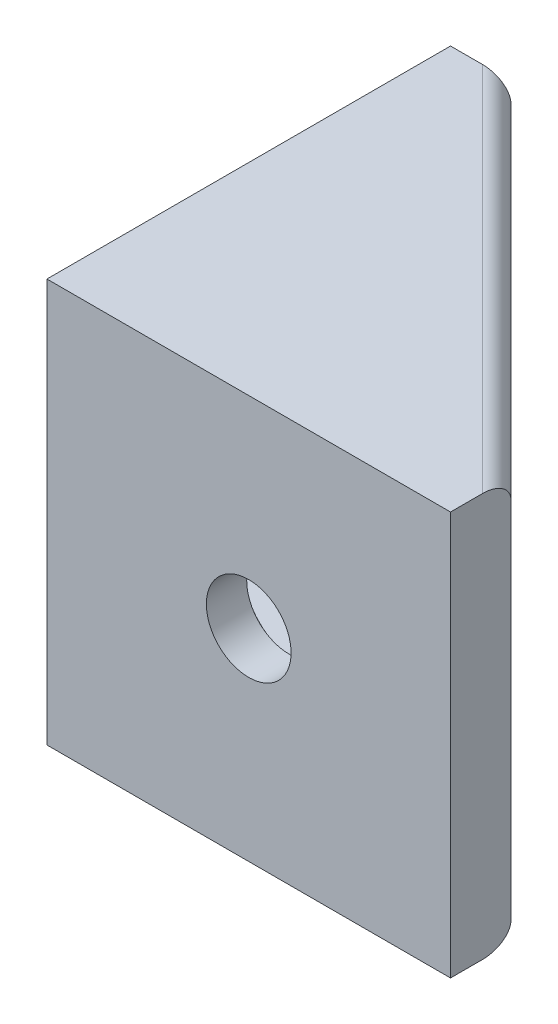
ISO-10303-21;
HEADER;
FILE_DESCRIPTION(('STEP AP214'),'2;1');
FILE_NAME('part.step','',(''),(''),'','','');
FILE_SCHEMA(('AUTOMOTIVE_DESIGN { 1 0 10303 214 1 1 1 1 }'));
ENDSEC;
DATA;
#1=APPLICATION_CONTEXT('core data for automotive mechanical design processes');
#2=APPLICATION_PROTOCOL_DEFINITION('international standard','automotive_design',2000,#1);
#3=PRODUCT_CONTEXT('',#1,'mechanical');
#4=PRODUCT('Part','Part','',(#3));
#5=PRODUCT_RELATED_PRODUCT_CATEGORY('part','',(#4));
#6=PRODUCT_DEFINITION_FORMATION('','',#4);
#7=PRODUCT_DEFINITION_CONTEXT('part definition',#1,'design');
#8=PRODUCT_DEFINITION('design','',#6,#7);
#9=PRODUCT_DEFINITION_SHAPE('','',#8);
#10=(LENGTH_UNIT() NAMED_UNIT(*) SI_UNIT(.MILLI.,.METRE.));
#11=(NAMED_UNIT(*) PLANE_ANGLE_UNIT() SI_UNIT($,.RADIAN.));
#12=(NAMED_UNIT(*) SI_UNIT($,.STERADIAN.) SOLID_ANGLE_UNIT());
#13=UNCERTAINTY_MEASURE_WITH_UNIT(LENGTH_MEASURE(1.E-05),#10,'distance_accuracy_value','');
#14=(GEOMETRIC_REPRESENTATION_CONTEXT(3) GLOBAL_UNCERTAINTY_ASSIGNED_CONTEXT((#13)) GLOBAL_UNIT_ASSIGNED_CONTEXT((#10,
#11,#12)) REPRESENTATION_CONTEXT('',''));
#15=CARTESIAN_POINT('',(0.,0.,0.));
#16=DIRECTION('',(0.,0.,1.));
#17=DIRECTION('',(1.,0.,0.));
#18=AXIS2_PLACEMENT_3D('',#15,#16,#17);
#19=CARTESIAN_POINT('',(3.,20.,-3.));
#20=DIRECTION('',(-1.,0.,0.));
#21=DIRECTION('',(0.,0.,1.));
#22=AXIS2_PLACEMENT_3D('',#19,#20,#21);
#23=PLANE('',#22);
#24=DIRECTION('',(0.,0.,-1.));
#25=VECTOR('',#24,1.);
#26=CARTESIAN_POINT('',(3.,13.5,-13.0000000000001));
#27=LINE('',#26,#25);
#28=CARTESIAN_POINT('',(3.,13.5,-10.));
#29=VERTEX_POINT('',#28);
#30=CARTESIAN_POINT('',(3.,13.5,-11.585786437627));
#31=VERTEX_POINT('',#30);
#32=EDGE_CURVE('E195',#29,#31,#27,.T.);
#33=ORIENTED_EDGE('',*,*,#32,.F.);
#34=CARTESIAN_POINT('',(3.,10.,-10.));
#35=DIRECTION('',(1.,0.,0.));
#36=DIRECTION('',(0.,0.,-1.));
#37=AXIS2_PLACEMENT_3D('',#34,#35,#36);
#38=CIRCLE('',#37,3.5);
#39=CARTESIAN_POINT('',(3.,6.5,-10.));
#40=VERTEX_POINT('',#39);
#41=EDGE_CURVE('E63',#40,#29,#38,.T.);
#42=ORIENTED_EDGE('',*,*,#41,.F.);
#43=DIRECTION('',(0.,0.,-1.));
#44=VECTOR('',#43,1.);
#45=CARTESIAN_POINT('',(3.,6.5,-13.0000000000001));
#46=LINE('',#45,#44);
#47=CARTESIAN_POINT('',(3.,6.5,-11.585786437627));
#48=VERTEX_POINT('',#47);
#49=EDGE_CURVE('E192',#40,#48,#46,.T.);
#50=ORIENTED_EDGE('',*,*,#49,.T.);
#51=CARTESIAN_POINT('',(3.,5.5,-11.585786437627));
#52=DIRECTION('',(-1.,0.,0.));
#53=DIRECTION('',(0.,0.,-1.));
#54=AXIS2_PLACEMENT_3D('',#51,#52,#53);
#55=ELLIPSE('',#54,1.4142135623731,1.);
#56=CARTESIAN_POINT('',(3.,5.5,-13.0000000000001));
#57=VERTEX_POINT('',#56);
#58=EDGE_CURVE('E11',#48,#57,#55,.T.);
#59=ORIENTED_EDGE('',*,*,#58,.T.);
#60=DIRECTION('',(0.,-1.,0.));
#61=VECTOR('',#60,1.);
#62=CARTESIAN_POINT('',(3.,3.,-13.0000000000001));
#63=LINE('',#62,#61);
#64=CARTESIAN_POINT('',(3.,4.,-13.0000000000001));
#65=VERTEX_POINT('',#64);
#66=EDGE_CURVE('E284',#57,#65,#63,.T.);
#67=ORIENTED_EDGE('',*,*,#66,.T.);
#68=CARTESIAN_POINT('',(3.,4.,-14.4142135623732));
#69=DIRECTION('',(-1.,0.,0.));
#70=DIRECTION('',(0.,0.,1.));
#71=AXIS2_PLACEMENT_3D('',#68,#69,#70);
#72=ELLIPSE('',#71,1.4142135623731,1.);
#73=CARTESIAN_POINT('',(3.,3.,-14.4142135623732));
#74=VERTEX_POINT('',#73);
#75=EDGE_CURVE('E315',#65,#74,#72,.F.);
#76=ORIENTED_EDGE('',*,*,#75,.T.);
#77=DIRECTION('',(0.,0.,-1.));
#78=VECTOR('',#77,1.);
#79=CARTESIAN_POINT('',(3.,3.,-20.));
#80=LINE('',#79,#78);
#81=CARTESIAN_POINT('',(3.,3.,-20.));
#82=VERTEX_POINT('',#81);
#83=EDGE_CURVE('E231',#74,#82,#80,.T.);
#84=ORIENTED_EDGE('',*,*,#83,.T.);
#85=DIRECTION('',(0.,-1.,0.));
#86=VECTOR('',#85,1.);
#87=CARTESIAN_POINT('',(3.,20.,-20.));
#88=LINE('',#87,#86);
#89=CARTESIAN_POINT('',(3.,17.,-20.));
#90=VERTEX_POINT('',#89);
#91=EDGE_CURVE('E261',#90,#82,#88,.T.);
#92=ORIENTED_EDGE('',*,*,#91,.F.);
#93=DIRECTION('',(0.,0.,1.));
#94=VECTOR('',#93,1.);
#95=CARTESIAN_POINT('',(3.,17.,-3.));
#96=LINE('',#95,#94);
#97=CARTESIAN_POINT('',(3.,17.,-14.4142135623732));
#98=VERTEX_POINT('',#97);
#99=EDGE_CURVE('E240',#90,#98,#96,.T.);
#100=ORIENTED_EDGE('',*,*,#99,.T.);
#101=CARTESIAN_POINT('',(3.,16.,-14.4142135623732));
#102=DIRECTION('',(-1.,0.,0.));
#103=DIRECTION('',(0.,0.,-1.));
#104=AXIS2_PLACEMENT_3D('',#101,#102,#103);
#105=ELLIPSE('',#104,1.4142135623731,1.);
#106=CARTESIAN_POINT('',(3.,16.,-13.0000000000001));
#107=VERTEX_POINT('',#106);
#108=EDGE_CURVE('E317',#98,#107,#105,.F.);
#109=ORIENTED_EDGE('',*,*,#108,.T.);
#110=CARTESIAN_POINT('',(3.,14.5,-13.0000000000001));
#111=VERTEX_POINT('',#110);
#112=EDGE_CURVE('E285',#107,#111,#63,.T.);
#113=ORIENTED_EDGE('',*,*,#112,.T.);
#114=CARTESIAN_POINT('',(3.,14.5,-11.585786437627));
#115=DIRECTION('',(-1.,0.,0.));
#116=DIRECTION('',(0.,0.,1.));
#117=AXIS2_PLACEMENT_3D('',#114,#115,#116);
#118=ELLIPSE('',#117,1.4142135623731,1.);
#119=EDGE_CURVE('E341',#111,#31,#118,.T.);
#120=ORIENTED_EDGE('',*,*,#119,.T.);
#121=EDGE_LOOP('',(#33,#42,#50,#59,#67,#76,#84,#92,#100,#109,#113,#120));
#122=FACE_BOUND('',#121,.T.);
#123=ADVANCED_FACE('F47',(#122),#23,.F.);
#124=CARTESIAN_POINT('',(-7.,10.,-10.));
#125=DIRECTION('',(1.,0.,0.));
#126=DIRECTION('',(0.,0.,-1.));
#127=AXIS2_PLACEMENT_3D('',#124,#125,#126);
#128=CYLINDRICAL_SURFACE('',#127,2.1);
#129=CARTESIAN_POINT('',(0.,10.,-10.));
#130=DIRECTION('',(1.,0.,0.));
#131=DIRECTION('',(0.,0.,-1.));
#132=AXIS2_PLACEMENT_3D('',#129,#130,#131);
#133=CIRCLE('',#132,2.1);
#134=CARTESIAN_POINT('',(0.,10.,-12.1));
#135=VERTEX_POINT('',#134);
#136=EDGE_CURVE('E211',#135,#135,#133,.T.);
#137=ORIENTED_EDGE('',*,*,#136,.F.);
#138=EDGE_LOOP('',(#137));
#139=FACE_BOUND('',#138,.T.);
#140=CARTESIAN_POINT('',(2.,10.,-10.));
#141=DIRECTION('',(1.,0.,0.));
#142=DIRECTION('',(0.,0.,-1.));
#143=AXIS2_PLACEMENT_3D('',#140,#141,#142);
#144=CIRCLE('',#143,2.1);
#145=CARTESIAN_POINT('',(2.,10.,-12.1));
#146=VERTEX_POINT('',#145);
#147=EDGE_CURVE('E51',#146,#146,#144,.F.);
#148=ORIENTED_EDGE('',*,*,#147,.F.);
#149=EDGE_LOOP('',(#148));
#150=FACE_BOUND('',#149,.T.);
#151=ADVANCED_FACE('F361',(#139,#150),#128,.F.);
#152=CARTESIAN_POINT('',(20.,20.,-3.));
#153=DIRECTION('',(0.,0.,1.));
#154=DIRECTION('',(1.,0.,0.));
#155=AXIS2_PLACEMENT_3D('',#152,#153,#154);
#156=PLANE('',#155);
#157=DIRECTION('',(1.,0.,0.));
#158=VECTOR('',#157,1.);
#159=CARTESIAN_POINT('',(10.,13.5,-3.));
#160=LINE('',#159,#158);
#161=CARTESIAN_POINT('',(3.,13.5,-3.));
#162=VERTEX_POINT('',#161);
#163=CARTESIAN_POINT('',(10.,13.5,-3.));
#164=VERTEX_POINT('',#163);
#165=EDGE_CURVE('E222',#162,#164,#160,.T.);
#166=ORIENTED_EDGE('',*,*,#165,.T.);
#167=CARTESIAN_POINT('',(10.,10.,-3.));
#168=DIRECTION('',(0.,0.,-1.));
#169=DIRECTION('',(-1.,0.,0.));
#170=AXIS2_PLACEMENT_3D('',#167,#168,#169);
#171=CIRCLE('',#170,3.5);
#172=CARTESIAN_POINT('',(10.,6.5,-3.));
#173=VERTEX_POINT('',#172);
#174=EDGE_CURVE('E70',#173,#164,#171,.T.);
#175=ORIENTED_EDGE('',*,*,#174,.F.);
#176=DIRECTION('',(1.,0.,0.));
#177=VECTOR('',#176,1.);
#178=CARTESIAN_POINT('',(10.,6.5,-3.));
#179=LINE('',#178,#177);
#180=CARTESIAN_POINT('',(3.,6.5,-3.));
#181=VERTEX_POINT('',#180);
#182=EDGE_CURVE('E218',#181,#173,#179,.T.);
#183=ORIENTED_EDGE('',*,*,#182,.F.);
#184=DIRECTION('',(0.,1.,0.));
#185=VECTOR('',#184,1.);
#186=CARTESIAN_POINT('',(3.,6.5,-3.));
#187=LINE('',#186,#185);
#188=EDGE_CURVE('E210',#181,#162,#187,.T.);
#189=ORIENTED_EDGE('',*,*,#188,.T.);
#190=EDGE_LOOP('',(#166,#175,#183,#189));
#191=FACE_BOUND('',#190,.T.);
#192=ADVANCED_FACE('F363',(#191),#156,.F.);
#193=CARTESIAN_POINT('',(10.,10.,0.));
#194=DIRECTION('',(0.,0.,-1.));
#195=DIRECTION('',(-1.,0.,0.));
#196=AXIS2_PLACEMENT_3D('',#193,#194,#195);
#197=CYLINDRICAL_SURFACE('',#196,2.1);
#198=CARTESIAN_POINT('',(10.,10.,0.));
#199=DIRECTION('',(0.,0.,-1.));
#200=DIRECTION('',(-1.,0.,0.));
#201=AXIS2_PLACEMENT_3D('',#198,#199,#200);
#202=CIRCLE('',#201,2.1);
#203=CARTESIAN_POINT('',(7.9,10.,0.));
#204=VERTEX_POINT('',#203);
#205=EDGE_CURVE('E225',#204,#204,#202,.T.);
#206=ORIENTED_EDGE('',*,*,#205,.F.);
#207=EDGE_LOOP('',(#206));
#208=FACE_BOUND('',#207,.T.);
#209=CARTESIAN_POINT('',(10.,10.,-2.));
#210=DIRECTION('',(0.,0.,-1.));
#211=DIRECTION('',(-1.,0.,0.));
#212=AXIS2_PLACEMENT_3D('',#209,#210,#211);
#213=CIRCLE('',#212,2.1);
#214=CARTESIAN_POINT('',(7.9,10.,-2.));
#215=VERTEX_POINT('',#214);
#216=EDGE_CURVE('E344',#215,#215,#213,.F.);
#217=ORIENTED_EDGE('',*,*,#216,.F.);
#218=EDGE_LOOP('',(#217));
#219=FACE_BOUND('',#218,.T.);
#220=ADVANCED_FACE('F370',(#208,#219),#197,.F.);
#221=CARTESIAN_POINT('',(3.,20.,-13.0000000000001));
#222=DIRECTION('',(0.707106781186551,0.,-0.707106781186544));
#223=DIRECTION('',(0.,1.,0.));
#224=AXIS2_PLACEMENT_3D('',#221,#222,#223);
#225=PLANE('',#224);
#226=DIRECTION('',(0.,1.,0.));
#227=VECTOR('',#226,1.);
#228=CARTESIAN_POINT('',(13.,17.,-3.));
#229=LINE('',#228,#227);
#230=CARTESIAN_POINT('',(13.,4.,-3.));
#231=VERTEX_POINT('',#230);
#232=CARTESIAN_POINT('',(13.,5.5,-3.));
#233=VERTEX_POINT('',#232);
#234=EDGE_CURVE('E289',#231,#233,#229,.T.);
#235=ORIENTED_EDGE('',*,*,#234,.F.);
#236=DIRECTION('',(0.707106781186544,0.,0.707106781186551));
#237=VECTOR('',#236,1.);
#238=CARTESIAN_POINT('',(3.,4.,-13.0000000000001));
#239=LINE('',#238,#237);
#240=EDGE_CURVE('E333',#231,#65,#239,.F.);
#241=ORIENTED_EDGE('',*,*,#240,.T.);
#242=ORIENTED_EDGE('',*,*,#66,.F.);
#243=DIRECTION('',(0.707106781186544,0.,0.707106781186551));
#244=VECTOR('',#243,1.);
#245=CARTESIAN_POINT('',(3.,5.50000000000001,-13.0000000000001));
#246=LINE('',#245,#244);
#247=EDGE_CURVE('E330',#57,#233,#246,.T.);
#248=ORIENTED_EDGE('',*,*,#247,.T.);
#249=EDGE_LOOP('',(#235,#241,#242,#248));
#250=FACE_BOUND('',#249,.T.);
#251=ADVANCED_FACE('F390',(#250),#225,.T.);
#252=CARTESIAN_POINT('',(11.5857864376269,6.5,-3.));
#253=VERTEX_POINT('',#252);
#254=EDGE_CURVE('E221',#173,#253,#179,.T.);
#255=ORIENTED_EDGE('',*,*,#254,.F.);
#256=EDGE_CURVE('E215',#164,#173,#171,.T.);
#257=ORIENTED_EDGE('',*,*,#256,.F.);
#258=CARTESIAN_POINT('',(11.5857864376269,13.5,-3.));
#259=VERTEX_POINT('',#258);
#260=EDGE_CURVE('E220',#164,#259,#160,.T.);
#261=ORIENTED_EDGE('',*,*,#260,.T.);
#262=CARTESIAN_POINT('',(11.5857864376269,14.5,-3.));
#263=DIRECTION('',(0.,0.,1.));
#264=DIRECTION('',(1.,0.,0.));
#265=AXIS2_PLACEMENT_3D('',#262,#263,#264);
#266=ELLIPSE('',#265,1.41421356237309,1.);
#267=CARTESIAN_POINT('',(13.,14.5,-3.));
#268=VERTEX_POINT('',#267);
#269=EDGE_CURVE('E339',#259,#268,#266,.T.);
#270=ORIENTED_EDGE('',*,*,#269,.T.);
#271=CARTESIAN_POINT('',(13.,16.,-3.));
#272=VERTEX_POINT('',#271);
#273=EDGE_CURVE('E288',#268,#272,#229,.T.);
#274=ORIENTED_EDGE('',*,*,#273,.T.);
#275=CARTESIAN_POINT('',(14.414213562373,16.,-3.));
#276=DIRECTION('',(0.,0.,1.));
#277=DIRECTION('',(-1.,0.,0.));
#278=AXIS2_PLACEMENT_3D('',#275,#276,#277);
#279=ELLIPSE('',#278,1.41421356237309,1.);
#280=CARTESIAN_POINT('',(14.4142135623731,17.,-3.));
#281=VERTEX_POINT('',#280);
#282=EDGE_CURVE('E325',#272,#281,#279,.F.);
#283=ORIENTED_EDGE('',*,*,#282,.T.);
#284=DIRECTION('',(1.,0.,0.));
#285=VECTOR('',#284,1.);
#286=CARTESIAN_POINT('',(20.,17.,-3.));
#287=LINE('',#286,#285);
#288=CARTESIAN_POINT('',(20.,17.,-3.));
#289=VERTEX_POINT('',#288);
#290=EDGE_CURVE('E245',#281,#289,#287,.T.);
#291=ORIENTED_EDGE('',*,*,#290,.T.);
#292=DIRECTION('',(0.,-1.,0.));
#293=VECTOR('',#292,1.);
#294=CARTESIAN_POINT('',(20.,20.,-3.));
#295=LINE('',#294,#293);
#296=CARTESIAN_POINT('',(20.,3.,-3.));
#297=VERTEX_POINT('',#296);
#298=EDGE_CURVE('E271',#289,#297,#295,.T.);
#299=ORIENTED_EDGE('',*,*,#298,.T.);
#300=DIRECTION('',(-1.,0.,0.));
#301=VECTOR('',#300,1.);
#302=CARTESIAN_POINT('',(3.,3.,-3.));
#303=LINE('',#302,#301);
#304=CARTESIAN_POINT('',(14.414213562373,3.,-3.));
#305=VERTEX_POINT('',#304);
#306=EDGE_CURVE('E228',#297,#305,#303,.T.);
#307=ORIENTED_EDGE('',*,*,#306,.T.);
#308=CARTESIAN_POINT('',(14.414213562373,4.,-3.));
#309=DIRECTION('',(0.,0.,1.));
#310=DIRECTION('',(1.,0.,0.));
#311=AXIS2_PLACEMENT_3D('',#308,#309,#310);
#312=ELLIPSE('',#311,1.41421356237309,1.);
#313=EDGE_CURVE('E323',#305,#231,#312,.F.);
#314=ORIENTED_EDGE('',*,*,#313,.T.);
#315=ORIENTED_EDGE('',*,*,#234,.T.);
#316=CARTESIAN_POINT('',(11.5857864376269,5.5,-3.));
#317=DIRECTION('',(0.,0.,1.));
#318=DIRECTION('',(-1.,0.,0.));
#319=AXIS2_PLACEMENT_3D('',#316,#317,#318);
#320=ELLIPSE('',#319,1.41421356237309,1.);
#321=EDGE_CURVE('E56',#233,#253,#320,.T.);
#322=ORIENTED_EDGE('',*,*,#321,.T.);
#323=EDGE_LOOP('',(#255,#257,#261,#270,#274,#283,#291,#299,#307,#314,#315,#322));
#324=FACE_BOUND('',#323,.T.);
#325=ADVANCED_FACE('F373',(#324),#156,.F.);
#326=EDGE_CURVE('E201',#181,#40,#46,.T.);
#327=ORIENTED_EDGE('',*,*,#326,.T.);
#328=EDGE_CURVE('E182',#29,#40,#38,.T.);
#329=ORIENTED_EDGE('',*,*,#328,.F.);
#330=EDGE_CURVE('E205',#162,#29,#27,.T.);
#331=ORIENTED_EDGE('',*,*,#330,.F.);
#332=ORIENTED_EDGE('',*,*,#188,.F.);
#333=EDGE_LOOP('',(#327,#329,#331,#332));
#334=FACE_BOUND('',#333,.T.);
#335=ADVANCED_FACE('F208',(#334),#23,.F.);
#336=CARTESIAN_POINT('',(3.,20.,-20.));
#337=DIRECTION('',(0.,0.,1.));
#338=DIRECTION('',(1.,0.,0.));
#339=AXIS2_PLACEMENT_3D('',#336,#337,#338);
#340=PLANE('',#339);
#341=DIRECTION('',(-1.,0.,0.));
#342=VECTOR('',#341,1.);
#343=CARTESIAN_POINT('',(3.,20.,-20.));
#344=LINE('',#343,#342);
#345=CARTESIAN_POINT('',(1.5857864376269,20.,-20.));
#346=VERTEX_POINT('',#345);
#347=CARTESIAN_POINT('',(0.,20.,-20.));
#348=VERTEX_POINT('',#347);
#349=EDGE_CURVE('E251',#346,#348,#344,.T.);
#350=ORIENTED_EDGE('',*,*,#349,.F.);
#351=CARTESIAN_POINT('',(1.5857864376269,19.,-20.));
#352=DIRECTION('',(0.,0.,1.));
#353=DIRECTION('',(-1.,0.,0.));
#354=AXIS2_PLACEMENT_3D('',#351,#352,#353);
#355=ELLIPSE('',#354,1.41421356237309,1.);
#356=CARTESIAN_POINT('',(3.,19.,-20.));
#357=VERTEX_POINT('',#356);
#358=EDGE_CURVE('E297',#346,#357,#355,.F.);
#359=ORIENTED_EDGE('',*,*,#358,.T.);
#360=EDGE_CURVE('E269',#357,#90,#88,.T.);
#361=ORIENTED_EDGE('',*,*,#360,.T.);
#362=ORIENTED_EDGE('',*,*,#91,.T.);
#363=DIRECTION('',(0.,-1.,0.));
#364=VECTOR('',#363,1.);
#365=CARTESIAN_POINT('',(3.,3.,-20.));
#366=LINE('',#365,#364);
#367=CARTESIAN_POINT('',(3.,1.,-20.));
#368=VERTEX_POINT('',#367);
#369=EDGE_CURVE('E236',#82,#368,#366,.T.);
#370=ORIENTED_EDGE('',*,*,#369,.T.);
#371=CARTESIAN_POINT('',(1.5857864376269,1.,-20.));
#372=DIRECTION('',(0.,0.,1.));
#373=DIRECTION('',(-1.,0.,0.));
#374=AXIS2_PLACEMENT_3D('',#371,#372,#373);
#375=ELLIPSE('',#374,1.41421356237309,1.);
#376=CARTESIAN_POINT('',(1.5857864376269,0.,-20.));
#377=VERTEX_POINT('',#376);
#378=EDGE_CURVE('E295',#368,#377,#375,.F.);
#379=ORIENTED_EDGE('',*,*,#378,.T.);
#380=DIRECTION('',(-1.,0.,0.));
#381=VECTOR('',#380,1.);
#382=CARTESIAN_POINT('',(3.,0.,-20.));
#383=LINE('',#382,#381);
#384=CARTESIAN_POINT('',(0.,0.,-20.));
#385=VERTEX_POINT('',#384);
#386=EDGE_CURVE('E250',#377,#385,#383,.T.);
#387=ORIENTED_EDGE('',*,*,#386,.T.);
#388=DIRECTION('',(0.,-1.,0.));
#389=VECTOR('',#388,1.);
#390=CARTESIAN_POINT('',(0.,20.,-20.));
#391=LINE('',#390,#389);
#392=EDGE_CURVE('E281',#348,#385,#391,.T.);
#393=ORIENTED_EDGE('',*,*,#392,.F.);
#394=EDGE_LOOP('',(#350,#359,#361,#362,#370,#379,#387,#393));
#395=FACE_BOUND('',#394,.T.);
#396=ADVANCED_FACE('F417',(#395),#340,.F.);
#397=CARTESIAN_POINT('',(0.,20.,-20.));
#398=DIRECTION('',(1.,0.,0.));
#399=DIRECTION('',(0.,0.,-1.));
#400=AXIS2_PLACEMENT_3D('',#397,#398,#399);
#401=PLANE('',#400);
#402=ORIENTED_EDGE('',*,*,#136,.T.);
#403=EDGE_LOOP('',(#402));
#404=FACE_BOUND('',#403,.T.);
#405=DIRECTION('',(0.,0.,1.));
#406=VECTOR('',#405,1.);
#407=CARTESIAN_POINT('',(0.,0.,-20.));
#408=LINE('',#407,#406);
#409=CARTESIAN_POINT('',(0.,0.,0.));
#410=VERTEX_POINT('',#409);
#411=EDGE_CURVE('E263',#385,#410,#408,.T.);
#412=ORIENTED_EDGE('',*,*,#411,.T.);
#413=DIRECTION('',(0.,-1.,0.));
#414=VECTOR('',#413,1.);
#415=CARTESIAN_POINT('',(0.,20.,0.));
#416=LINE('',#415,#414);
#417=CARTESIAN_POINT('',(0.,20.,0.));
#418=VERTEX_POINT('',#417);
#419=EDGE_CURVE('E278',#418,#410,#416,.T.);
#420=ORIENTED_EDGE('',*,*,#419,.F.);
#421=DIRECTION('',(0.,0.,1.));
#422=VECTOR('',#421,1.);
#423=CARTESIAN_POINT('',(0.,20.,-20.));
#424=LINE('',#423,#422);
#425=EDGE_CURVE('E253',#348,#418,#424,.T.);
#426=ORIENTED_EDGE('',*,*,#425,.F.);
#427=ORIENTED_EDGE('',*,*,#392,.T.);
#428=EDGE_LOOP('',(#412,#420,#426,#427));
#429=FACE_BOUND('',#428,.T.);
#430=ADVANCED_FACE('F427',(#404,#429),#401,.F.);
#431=CARTESIAN_POINT('',(0.,20.,0.));
#432=DIRECTION('',(0.,0.,-1.));
#433=DIRECTION('',(-1.,0.,0.));
#434=AXIS2_PLACEMENT_3D('',#431,#432,#433);
#435=PLANE('',#434);
#436=ORIENTED_EDGE('',*,*,#205,.T.);
#437=EDGE_LOOP('',(#436));
#438=FACE_BOUND('',#437,.T.);
#439=DIRECTION('',(1.,0.,0.));
#440=VECTOR('',#439,1.);
#441=CARTESIAN_POINT('',(0.,0.,0.));
#442=LINE('',#441,#440);
#443=CARTESIAN_POINT('',(20.,0.,0.));
#444=VERTEX_POINT('',#443);
#445=EDGE_CURVE('E265',#410,#444,#442,.T.);
#446=ORIENTED_EDGE('',*,*,#445,.T.);
#447=DIRECTION('',(0.,-1.,0.));
#448=VECTOR('',#447,1.);
#449=CARTESIAN_POINT('',(20.,20.,0.));
#450=LINE('',#449,#448);
#451=CARTESIAN_POINT('',(20.,20.,0.));
#452=VERTEX_POINT('',#451);
#453=EDGE_CURVE('E275',#452,#444,#450,.T.);
#454=ORIENTED_EDGE('',*,*,#453,.F.);
#455=DIRECTION('',(1.,0.,0.));
#456=VECTOR('',#455,1.);
#457=CARTESIAN_POINT('',(0.,20.,0.));
#458=LINE('',#457,#456);
#459=EDGE_CURVE('E256',#418,#452,#458,.T.);
#460=ORIENTED_EDGE('',*,*,#459,.F.);
#461=ORIENTED_EDGE('',*,*,#419,.T.);
#462=EDGE_LOOP('',(#446,#454,#460,#461));
#463=FACE_BOUND('',#462,.T.);
#464=ADVANCED_FACE('F423',(#438,#463),#435,.F.);
#465=CARTESIAN_POINT('',(20.,20.,0.));
#466=DIRECTION('',(-1.,0.,0.));
#467=DIRECTION('',(0.,0.,1.));
#468=AXIS2_PLACEMENT_3D('',#465,#466,#467);
#469=PLANE('',#468);
#470=CARTESIAN_POINT('',(20.,19.,-3.));
#471=VERTEX_POINT('',#470);
#472=EDGE_CURVE('E272',#471,#289,#295,.T.);
#473=ORIENTED_EDGE('',*,*,#472,.F.);
#474=CARTESIAN_POINT('',(20.,19.,-1.5857864376269));
#475=DIRECTION('',(-1.,0.,0.));
#476=DIRECTION('',(0.,0.,-1.));
#477=AXIS2_PLACEMENT_3D('',#474,#475,#476);
#478=ELLIPSE('',#477,1.41421356237309,1.);
#479=CARTESIAN_POINT('',(20.,20.,-1.5857864376269));
#480=VERTEX_POINT('',#479);
#481=EDGE_CURVE('E303',#471,#480,#478,.F.);
#482=ORIENTED_EDGE('',*,*,#481,.T.);
#483=DIRECTION('',(0.,0.,-1.));
#484=VECTOR('',#483,1.);
#485=CARTESIAN_POINT('',(20.,20.,0.));
#486=LINE('',#485,#484);
#487=EDGE_CURVE('E258',#452,#480,#486,.T.);
#488=ORIENTED_EDGE('',*,*,#487,.F.);
#489=ORIENTED_EDGE('',*,*,#453,.T.);
#490=DIRECTION('',(0.,0.,-1.));
#491=VECTOR('',#490,1.);
#492=CARTESIAN_POINT('',(20.,0.,0.));
#493=LINE('',#492,#491);
#494=CARTESIAN_POINT('',(20.,0.,-1.5857864376269));
#495=VERTEX_POINT('',#494);
#496=EDGE_CURVE('E254',#444,#495,#493,.T.);
#497=ORIENTED_EDGE('',*,*,#496,.T.);
#498=CARTESIAN_POINT('',(20.,1.,-1.5857864376269));
#499=DIRECTION('',(-1.,0.,0.));
#500=DIRECTION('',(0.,0.,-1.));
#501=AXIS2_PLACEMENT_3D('',#498,#499,#500);
#502=ELLIPSE('',#501,1.41421356237309,1.);
#503=CARTESIAN_POINT('',(20.,1.,-3.));
#504=VERTEX_POINT('',#503);
#505=EDGE_CURVE('E301',#495,#504,#502,.F.);
#506=ORIENTED_EDGE('',*,*,#505,.T.);
#507=DIRECTION('',(0.,-1.,0.));
#508=VECTOR('',#507,1.);
#509=CARTESIAN_POINT('',(20.,3.,-3.));
#510=LINE('',#509,#508);
#511=EDGE_CURVE('E237',#297,#504,#510,.T.);
#512=ORIENTED_EDGE('',*,*,#511,.F.);
#513=ORIENTED_EDGE('',*,*,#298,.F.);
#514=EDGE_LOOP('',(#473,#482,#488,#489,#497,#506,#512,#513));
#515=FACE_BOUND('',#514,.T.);
#516=ADVANCED_FACE('F412',(#515),#469,.F.);
#517=CARTESIAN_POINT('',(0.,20.,0.));
#518=DIRECTION('',(0.,1.,0.));
#519=DIRECTION('',(0.,0.,1.));
#520=AXIS2_PLACEMENT_3D('',#517,#518,#519);
#521=PLANE('',#520);
#522=ORIENTED_EDGE('',*,*,#487,.T.);
#523=DIRECTION('',(-0.707106781186548,0.,-0.707106781186548));
#524=VECTOR('',#523,1.);
#525=CARTESIAN_POINT('',(10.7928932188134,20.,-10.7928932188134));
#526=LINE('',#525,#524);
#527=EDGE_CURVE('E292',#480,#346,#526,.T.);
#528=ORIENTED_EDGE('',*,*,#527,.T.);
#529=ORIENTED_EDGE('',*,*,#349,.T.);
#530=ORIENTED_EDGE('',*,*,#425,.T.);
#531=ORIENTED_EDGE('',*,*,#459,.T.);
#532=EDGE_LOOP('',(#522,#528,#529,#530,#531));
#533=FACE_BOUND('',#532,.T.);
#534=ADVANCED_FACE('F409',(#533),#521,.T.);
#535=CARTESIAN_POINT('',(0.,0.,0.));
#536=DIRECTION('',(0.,1.,0.));
#537=DIRECTION('',(0.,0.,1.));
#538=AXIS2_PLACEMENT_3D('',#535,#536,#537);
#539=PLANE('',#538);
#540=ORIENTED_EDGE('',*,*,#386,.F.);
#541=DIRECTION('',(0.707106781186548,0.,0.707106781186548));
#542=VECTOR('',#541,1.);
#543=CARTESIAN_POINT('',(19.2928932188135,0.,-2.29289321881345));
#544=LINE('',#543,#542);
#545=EDGE_CURVE('E305',#377,#495,#544,.T.);
#546=ORIENTED_EDGE('',*,*,#545,.T.);
#547=ORIENTED_EDGE('',*,*,#496,.F.);
#548=ORIENTED_EDGE('',*,*,#445,.F.);
#549=ORIENTED_EDGE('',*,*,#411,.F.);
#550=EDGE_LOOP('',(#540,#546,#547,#548,#549));
#551=FACE_BOUND('',#550,.T.);
#552=ADVANCED_FACE('F407',(#551),#539,.F.);
#553=CARTESIAN_POINT('',(3.,17.,-20.));
#554=DIRECTION('',(0.707106781186548,0.,-0.707106781186548));
#555=DIRECTION('',(-0.707106781186548,0.,-0.707106781186548));
#556=AXIS2_PLACEMENT_3D('',#553,#554,#555);
#557=PLANE('',#556);
#558=ORIENTED_EDGE('',*,*,#360,.F.);
#559=DIRECTION('',(-0.707106781186548,0.,-0.707106781186548));
#560=VECTOR('',#559,1.);
#561=CARTESIAN_POINT('',(3.,19.,-20.));
#562=LINE('',#561,#560);
#563=EDGE_CURVE('E299',#357,#471,#562,.F.);
#564=ORIENTED_EDGE('',*,*,#563,.T.);
#565=ORIENTED_EDGE('',*,*,#472,.T.);
#566=DIRECTION('',(-0.707106781186547,0.,-0.707106781186547));
#567=VECTOR('',#566,1.);
#568=CARTESIAN_POINT('',(3.,17.,-20.));
#569=LINE('',#568,#567);
#570=EDGE_CURVE('E247',#289,#90,#569,.T.);
#571=ORIENTED_EDGE('',*,*,#570,.T.);
#572=EDGE_LOOP('',(#558,#564,#565,#571));
#573=FACE_BOUND('',#572,.T.);
#574=ADVANCED_FACE('F403',(#573),#557,.T.);
#575=CARTESIAN_POINT('',(0.,17.,0.));
#576=DIRECTION('',(0.,1.,0.));
#577=DIRECTION('',(0.,0.,1.));
#578=AXIS2_PLACEMENT_3D('',#575,#576,#577);
#579=PLANE('',#578);
#580=ORIENTED_EDGE('',*,*,#290,.F.);
#581=DIRECTION('',(0.707106781186544,0.,0.707106781186551));
#582=VECTOR('',#581,1.);
#583=CARTESIAN_POINT('',(3.70710678118655,17.,-13.7071067811866));
#584=LINE('',#583,#582);
#585=EDGE_CURVE('E310',#281,#98,#584,.F.);
#586=ORIENTED_EDGE('',*,*,#585,.T.);
#587=ORIENTED_EDGE('',*,*,#99,.F.);
#588=ORIENTED_EDGE('',*,*,#570,.F.);
#589=EDGE_LOOP('',(#580,#586,#587,#588));
#590=FACE_BOUND('',#589,.T.);
#591=ADVANCED_FACE('F399',(#590),#579,.F.);
#592=CARTESIAN_POINT('',(20.,3.,-3.));
#593=DIRECTION('',(0.707106781186548,0.,-0.707106781186548));
#594=DIRECTION('',(-0.707106781186548,0.,-0.707106781186548));
#595=AXIS2_PLACEMENT_3D('',#592,#593,#594);
#596=PLANE('',#595);
#597=ORIENTED_EDGE('',*,*,#511,.T.);
#598=DIRECTION('',(0.707106781186548,0.,0.707106781186548));
#599=VECTOR('',#598,1.);
#600=CARTESIAN_POINT('',(3.,1.,-20.));
#601=LINE('',#600,#599);
#602=EDGE_CURVE('E308',#504,#368,#601,.F.);
#603=ORIENTED_EDGE('',*,*,#602,.T.);
#604=ORIENTED_EDGE('',*,*,#369,.F.);
#605=DIRECTION('',(0.707106781186547,0.,0.707106781186547));
#606=VECTOR('',#605,1.);
#607=CARTESIAN_POINT('',(20.,3.,-3.));
#608=LINE('',#607,#606);
#609=EDGE_CURVE('E233',#82,#297,#608,.T.);
#610=ORIENTED_EDGE('',*,*,#609,.T.);
#611=EDGE_LOOP('',(#597,#603,#604,#610));
#612=FACE_BOUND('',#611,.T.);
#613=ADVANCED_FACE('F395',(#612),#596,.T.);
#614=CARTESIAN_POINT('',(0.,3.,0.));
#615=DIRECTION('',(0.,-1.,0.));
#616=DIRECTION('',(0.,0.,-1.));
#617=AXIS2_PLACEMENT_3D('',#614,#615,#616);
#618=PLANE('',#617);
#619=ORIENTED_EDGE('',*,*,#83,.F.);
#620=DIRECTION('',(-0.707106781186544,0.,-0.707106781186551));
#621=VECTOR('',#620,1.);
#622=CARTESIAN_POINT('',(13.7071067811865,3.,-3.70710678118654));
#623=LINE('',#622,#621);
#624=EDGE_CURVE('E327',#74,#305,#623,.F.);
#625=ORIENTED_EDGE('',*,*,#624,.T.);
#626=ORIENTED_EDGE('',*,*,#306,.F.);
#627=ORIENTED_EDGE('',*,*,#609,.F.);
#628=EDGE_LOOP('',(#619,#625,#626,#627));
#629=FACE_BOUND('',#628,.T.);
#630=ADVANCED_FACE('F392',(#629),#618,.F.);
#631=ORIENTED_EDGE('',*,*,#112,.F.);
#632=DIRECTION('',(-0.707106781186544,0.,-0.707106781186551));
#633=VECTOR('',#632,1.);
#634=CARTESIAN_POINT('',(13.,16.,-3.));
#635=LINE('',#634,#633);
#636=EDGE_CURVE('E321',#107,#272,#635,.F.);
#637=ORIENTED_EDGE('',*,*,#636,.T.);
#638=ORIENTED_EDGE('',*,*,#273,.F.);
#639=DIRECTION('',(0.707106781186544,0.,0.707106781186551));
#640=VECTOR('',#639,1.);
#641=CARTESIAN_POINT('',(3.,14.5,-13.0000000000001));
#642=LINE('',#641,#640);
#643=EDGE_CURVE('E319',#268,#111,#642,.F.);
#644=ORIENTED_EDGE('',*,*,#643,.T.);
#645=EDGE_LOOP('',(#631,#637,#638,#644));
#646=FACE_BOUND('',#645,.T.);
#647=ADVANCED_FACE('F387',(#646),#225,.T.);
#648=CARTESIAN_POINT('',(10.,6.5,-13.));
#649=DIRECTION('',(0.,-1.,0.));
#650=DIRECTION('',(1.,0.,0.));
#651=AXIS2_PLACEMENT_3D('',#648,#649,#650);
#652=PLANE('',#651);
#653=ORIENTED_EDGE('',*,*,#182,.T.);
#654=ORIENTED_EDGE('',*,*,#254,.T.);
#655=DIRECTION('',(-0.707106781186544,0.,-0.707106781186551));
#656=VECTOR('',#655,1.);
#657=CARTESIAN_POINT('',(5.79289321881345,6.5,-8.79289321881349));
#658=LINE('',#657,#656);
#659=EDGE_CURVE('E203',#253,#48,#658,.T.);
#660=ORIENTED_EDGE('',*,*,#659,.T.);
#661=ORIENTED_EDGE('',*,*,#49,.F.);
#662=ORIENTED_EDGE('',*,*,#326,.F.);
#663=EDGE_LOOP('',(#653,#654,#660,#661,#662));
#664=FACE_BOUND('',#663,.T.);
#665=ADVANCED_FACE('F200',(#664),#652,.F.);
#666=CARTESIAN_POINT('',(10.,13.5,-13.));
#667=DIRECTION('',(0.,-1.,0.));
#668=DIRECTION('',(0.,0.,-1.));
#669=AXIS2_PLACEMENT_3D('',#666,#667,#668);
#670=PLANE('',#669);
#671=ORIENTED_EDGE('',*,*,#330,.T.);
#672=ORIENTED_EDGE('',*,*,#32,.T.);
#673=DIRECTION('',(-0.707106781186544,0.,-0.707106781186551));
#674=VECTOR('',#673,1.);
#675=CARTESIAN_POINT('',(12.2928932188134,13.5,-2.29289321881345));
#676=LINE('',#675,#674);
#677=EDGE_CURVE('E335',#31,#259,#676,.F.);
#678=ORIENTED_EDGE('',*,*,#677,.T.);
#679=ORIENTED_EDGE('',*,*,#260,.F.);
#680=ORIENTED_EDGE('',*,*,#165,.F.);
#681=EDGE_LOOP('',(#671,#672,#678,#679,#680));
#682=FACE_BOUND('',#681,.T.);
#683=ADVANCED_FACE('F380',(#682),#670,.T.);
#684=CARTESIAN_POINT('',(10.7928932188135,19.,-10.7928932188135));
#685=DIRECTION('',(-0.707106781186548,0.,-0.707106781186548));
#686=DIRECTION('',(-0.707106781186548,0.,0.707106781186548));
#687=AXIS2_PLACEMENT_3D('',#684,#685,#686);
#688=CYLINDRICAL_SURFACE('',#687,1.);
#689=ORIENTED_EDGE('',*,*,#481,.F.);
#690=ORIENTED_EDGE('',*,*,#563,.F.);
#691=ORIENTED_EDGE('',*,*,#358,.F.);
#692=ORIENTED_EDGE('',*,*,#527,.F.);
#693=EDGE_LOOP('',(#689,#690,#691,#692));
#694=FACE_BOUND('',#693,.T.);
#695=ADVANCED_FACE('F383',(#694),#688,.T.);
#696=CARTESIAN_POINT('',(10.7928932188135,1.,-10.7928932188135));
#697=DIRECTION('',(-0.707106781186548,0.,-0.707106781186548));
#698=DIRECTION('',(-0.707106781186548,0.,0.707106781186548));
#699=AXIS2_PLACEMENT_3D('',#696,#697,#698);
#700=CYLINDRICAL_SURFACE('',#699,1.);
#701=ORIENTED_EDGE('',*,*,#378,.F.);
#702=ORIENTED_EDGE('',*,*,#602,.F.);
#703=ORIENTED_EDGE('',*,*,#505,.F.);
#704=ORIENTED_EDGE('',*,*,#545,.F.);
#705=EDGE_LOOP('',(#701,#702,#703,#704));
#706=FACE_BOUND('',#705,.T.);
#707=ADVANCED_FACE('F443',(#706),#700,.T.);
#708=CARTESIAN_POINT('',(8.7071067811866,16.,-8.70710678118651));
#709=DIRECTION('',(-0.707106781186544,0.,-0.707106781186551));
#710=DIRECTION('',(-0.707106781186551,0.,0.707106781186544));
#711=AXIS2_PLACEMENT_3D('',#708,#709,#710);
#712=CYLINDRICAL_SURFACE('',#711,1.);
#713=ORIENTED_EDGE('',*,*,#282,.F.);
#714=ORIENTED_EDGE('',*,*,#636,.F.);
#715=ORIENTED_EDGE('',*,*,#108,.F.);
#716=ORIENTED_EDGE('',*,*,#585,.F.);
#717=EDGE_LOOP('',(#713,#714,#715,#716));
#718=FACE_BOUND('',#717,.T.);
#719=ADVANCED_FACE('F447',(#718),#712,.F.);
#720=CARTESIAN_POINT('',(8.7071067811866,4.,-8.70710678118651));
#721=DIRECTION('',(0.707106781186544,0.,0.707106781186551));
#722=DIRECTION('',(0.707106781186551,0.,-0.707106781186544));
#723=AXIS2_PLACEMENT_3D('',#720,#721,#722);
#724=CYLINDRICAL_SURFACE('',#723,1.);
#725=ORIENTED_EDGE('',*,*,#75,.F.);
#726=ORIENTED_EDGE('',*,*,#240,.F.);
#727=ORIENTED_EDGE('',*,*,#313,.F.);
#728=ORIENTED_EDGE('',*,*,#624,.F.);
#729=EDGE_LOOP('',(#725,#726,#727,#728));
#730=FACE_BOUND('',#729,.T.);
#731=ADVANCED_FACE('F451',(#730),#724,.F.);
#732=CARTESIAN_POINT('',(5.79289321881345,14.5,-8.79289321881349));
#733=DIRECTION('',(0.707106781186544,0.,0.707106781186551));
#734=DIRECTION('',(0.707106781186551,0.,-0.707106781186544));
#735=AXIS2_PLACEMENT_3D('',#732,#733,#734);
#736=CYLINDRICAL_SURFACE('',#735,1.);
#737=ORIENTED_EDGE('',*,*,#119,.F.);
#738=ORIENTED_EDGE('',*,*,#643,.F.);
#739=ORIENTED_EDGE('',*,*,#269,.F.);
#740=ORIENTED_EDGE('',*,*,#677,.F.);
#741=EDGE_LOOP('',(#737,#738,#739,#740));
#742=FACE_BOUND('',#741,.T.);
#743=ADVANCED_FACE('F454',(#742),#736,.T.);
#744=CARTESIAN_POINT('',(2.29289321881345,5.5,-12.2928932188135));
#745=DIRECTION('',(-0.707106781186544,0.,-0.707106781186551));
#746=DIRECTION('',(-0.707106781186551,0.,0.707106781186544));
#747=AXIS2_PLACEMENT_3D('',#744,#745,#746);
#748=CYLINDRICAL_SURFACE('',#747,1.);
#749=ORIENTED_EDGE('',*,*,#58,.F.);
#750=ORIENTED_EDGE('',*,*,#659,.F.);
#751=ORIENTED_EDGE('',*,*,#321,.F.);
#752=ORIENTED_EDGE('',*,*,#247,.F.);
#753=EDGE_LOOP('',(#749,#750,#751,#752));
#754=FACE_BOUND('',#753,.T.);
#755=ADVANCED_FACE('F49',(#754),#748,.T.);
#756=CARTESIAN_POINT('',(10.,10.,-2.));
#757=DIRECTION('',(0.,0.,-1.));
#758=DIRECTION('',(-1.,0.,0.));
#759=AXIS2_PLACEMENT_3D('',#756,#757,#758);
#760=PLANE('',#759);
#761=CARTESIAN_POINT('',(10.,10.,-2.));
#762=DIRECTION('',(0.,0.,-1.));
#763=DIRECTION('',(-1.,0.,0.));
#764=AXIS2_PLACEMENT_3D('',#761,#762,#763);
#765=CIRCLE('',#764,3.5);
#766=CARTESIAN_POINT('',(6.5,10.,-2.));
#767=VERTEX_POINT('',#766);
#768=EDGE_CURVE('E346',#767,#767,#765,.T.);
#769=ORIENTED_EDGE('',*,*,#768,.T.);
#770=EDGE_LOOP('',(#769));
#771=FACE_BOUND('',#770,.T.);
#772=ORIENTED_EDGE('',*,*,#216,.T.);
#773=EDGE_LOOP('',(#772));
#774=FACE_BOUND('',#773,.T.);
#775=ADVANCED_FACE('F461',(#771,#774),#760,.T.);
#776=CARTESIAN_POINT('',(10.,10.,-2.));
#777=DIRECTION('',(0.,0.,-1.));
#778=DIRECTION('',(-1.,0.,0.));
#779=AXIS2_PLACEMENT_3D('',#776,#777,#778);
#780=CYLINDRICAL_SURFACE('',#779,3.5);
#781=ORIENTED_EDGE('',*,*,#768,.F.);
#782=EDGE_LOOP('',(#781));
#783=FACE_BOUND('',#782,.T.);
#784=ORIENTED_EDGE('',*,*,#256,.T.);
#785=ORIENTED_EDGE('',*,*,#174,.T.);
#786=EDGE_LOOP('',(#784,#785));
#787=FACE_BOUND('',#786,.T.);
#788=ADVANCED_FACE('F378',(#783,#787),#780,.F.);
#789=CARTESIAN_POINT('',(2.,10.,-10.));
#790=DIRECTION('',(1.,0.,0.));
#791=DIRECTION('',(0.,0.,-1.));
#792=AXIS2_PLACEMENT_3D('',#789,#790,#791);
#793=PLANE('',#792);
#794=CARTESIAN_POINT('',(2.,10.,-10.));
#795=DIRECTION('',(1.,0.,0.));
#796=DIRECTION('',(0.,0.,-1.));
#797=AXIS2_PLACEMENT_3D('',#794,#795,#796);
#798=CIRCLE('',#797,3.5);
#799=CARTESIAN_POINT('',(2.,10.,-13.5));
#800=VERTEX_POINT('',#799);
#801=EDGE_CURVE('E188',#800,#800,#798,.T.);
#802=ORIENTED_EDGE('',*,*,#801,.T.);
#803=EDGE_LOOP('',(#802));
#804=FACE_BOUND('',#803,.T.);
#805=ORIENTED_EDGE('',*,*,#147,.T.);
#806=EDGE_LOOP('',(#805));
#807=FACE_BOUND('',#806,.T.);
#808=ADVANCED_FACE('F359',(#804,#807),#793,.T.);
#809=CARTESIAN_POINT('',(2.,10.,-10.));
#810=DIRECTION('',(1.,0.,0.));
#811=DIRECTION('',(0.,0.,-1.));
#812=AXIS2_PLACEMENT_3D('',#809,#810,#811);
#813=CYLINDRICAL_SURFACE('',#812,3.5);
#814=ORIENTED_EDGE('',*,*,#801,.F.);
#815=EDGE_LOOP('',(#814));
#816=FACE_BOUND('',#815,.T.);
#817=ORIENTED_EDGE('',*,*,#328,.T.);
#818=ORIENTED_EDGE('',*,*,#41,.T.);
#819=EDGE_LOOP('',(#817,#818));
#820=FACE_BOUND('',#819,.T.);
#821=ADVANCED_FACE('F183',(#816,#820),#813,.F.);
#822=CLOSED_SHELL('',(#123,#151,#192,#220,#251,#325,#335,#396,#430,#464,#516,#534,#552,#574,
#591,#613,#630,#647,#665,#683,#695,#707,#719,#731,#743,#755,#775,#788,#808,#821));
#823=MANIFOLD_SOLID_BREP('B2',#822);
#824=ADVANCED_BREP_SHAPE_REPRESENTATION('',(#18,#823),#14);
#825=SHAPE_DEFINITION_REPRESENTATION(#9,#824);
ENDSEC;
END-ISO-10303-21;
